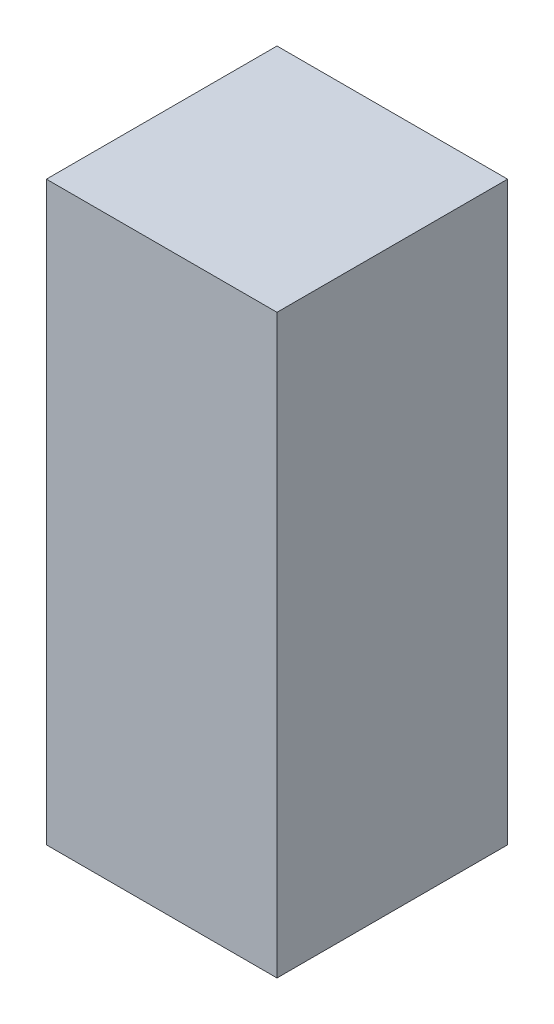
ISO-10303-21;
HEADER;
FILE_DESCRIPTION(('STEP AP214'),'2;1');
FILE_NAME('part.step','',(''),(''),'','','');
FILE_SCHEMA(('AUTOMOTIVE_DESIGN { 1 0 10303 214 1 1 1 1 }'));
ENDSEC;
DATA;
#1=APPLICATION_CONTEXT('core data for automotive mechanical design processes');
#2=APPLICATION_PROTOCOL_DEFINITION('international standard','automotive_design',2000,#1);
#3=PRODUCT_CONTEXT('',#1,'mechanical');
#4=PRODUCT('Part','Part','',(#3));
#5=PRODUCT_RELATED_PRODUCT_CATEGORY('part','',(#4));
#6=PRODUCT_DEFINITION_FORMATION('','',#4);
#7=PRODUCT_DEFINITION_CONTEXT('part definition',#1,'design');
#8=PRODUCT_DEFINITION('design','',#6,#7);
#9=PRODUCT_DEFINITION_SHAPE('','',#8);
#10=(LENGTH_UNIT() NAMED_UNIT(*) SI_UNIT(.MILLI.,.METRE.));
#11=(NAMED_UNIT(*) PLANE_ANGLE_UNIT() SI_UNIT($,.RADIAN.));
#12=(NAMED_UNIT(*) SI_UNIT($,.STERADIAN.) SOLID_ANGLE_UNIT());
#13=UNCERTAINTY_MEASURE_WITH_UNIT(LENGTH_MEASURE(1.E-05),#10,'distance_accuracy_value','');
#14=(GEOMETRIC_REPRESENTATION_CONTEXT(3) GLOBAL_UNCERTAINTY_ASSIGNED_CONTEXT((#13)) GLOBAL_UNIT_ASSIGNED_CONTEXT((#10,
#11,#12)) REPRESENTATION_CONTEXT('',''));
#15=CARTESIAN_POINT('',(0.,0.,0.));
#16=DIRECTION('',(0.,0.,1.));
#17=DIRECTION('',(1.,0.,0.));
#18=AXIS2_PLACEMENT_3D('',#15,#16,#17);
#19=CARTESIAN_POINT('',(-487.247374962251,100.,647.030369645084));
#20=DIRECTION('',(1.,0.,0.));
#21=DIRECTION('',(0.,0.,-1.));
#22=AXIS2_PLACEMENT_3D('',#19,#20,#21);
#23=PLANE('',#22);
#24=DIRECTION('',(0.,0.,1.));
#25=VECTOR('',#24,1.);
#26=CARTESIAN_POINT('',(-487.247374962251,0.,647.030369645084));
#27=LINE('',#26,#25);
#28=CARTESIAN_POINT('',(-487.247374962251,0.,647.030369645084));
#29=VERTEX_POINT('',#28);
#30=CARTESIAN_POINT('',(-487.247374962251,0.,687.030369645084));
#31=VERTEX_POINT('',#30);
#32=EDGE_CURVE('E98',#29,#31,#27,.T.);
#33=ORIENTED_EDGE('',*,*,#32,.T.);
#34=DIRECTION('',(0.,-1.,0.));
#35=VECTOR('',#34,1.);
#36=CARTESIAN_POINT('',(-487.247374962251,100.,687.030369645084));
#37=LINE('',#36,#35);
#38=CARTESIAN_POINT('',(-487.247374962251,100.,687.030369645084));
#39=VERTEX_POINT('',#38);
#40=EDGE_CURVE('E11',#39,#31,#37,.T.);
#41=ORIENTED_EDGE('',*,*,#40,.F.);
#42=DIRECTION('',(0.,0.,1.));
#43=VECTOR('',#42,1.);
#44=CARTESIAN_POINT('',(-487.247374962251,100.,647.030369645084));
#45=LINE('',#44,#43);
#46=CARTESIAN_POINT('',(-487.247374962251,100.,647.030369645084));
#47=VERTEX_POINT('',#46);
#48=EDGE_CURVE('E86',#47,#39,#45,.T.);
#49=ORIENTED_EDGE('',*,*,#48,.F.);
#50=DIRECTION('',(0.,-1.,0.));
#51=VECTOR('',#50,1.);
#52=CARTESIAN_POINT('',(-487.247374962251,100.,647.030369645084));
#53=LINE('',#52,#51);
#54=EDGE_CURVE('E94',#47,#29,#53,.T.);
#55=ORIENTED_EDGE('',*,*,#54,.T.);
#56=EDGE_LOOP('',(#33,#41,#49,#55));
#57=FACE_BOUND('',#56,.T.);
#58=ADVANCED_FACE('F35',(#57),#23,.F.);
#59=CARTESIAN_POINT('',(-487.247374962251,100.,687.030369645084));
#60=DIRECTION('',(0.,0.,-1.));
#61=DIRECTION('',(-1.,0.,0.));
#62=AXIS2_PLACEMENT_3D('',#59,#60,#61);
#63=PLANE('',#62);
#64=DIRECTION('',(1.,0.,0.));
#65=VECTOR('',#64,1.);
#66=CARTESIAN_POINT('',(-487.247374962251,0.,687.030369645084));
#67=LINE('',#66,#65);
#68=CARTESIAN_POINT('',(-447.247374962251,0.,687.030369645084));
#69=VERTEX_POINT('',#68);
#70=EDGE_CURVE('E90',#31,#69,#67,.T.);
#71=ORIENTED_EDGE('',*,*,#70,.T.);
#72=DIRECTION('',(0.,-1.,0.));
#73=VECTOR('',#72,1.);
#74=CARTESIAN_POINT('',(-447.247374962251,100.,687.030369645084));
#75=LINE('',#74,#73);
#76=CARTESIAN_POINT('',(-447.247374962251,100.,687.030369645084));
#77=VERTEX_POINT('',#76);
#78=EDGE_CURVE('E43',#77,#69,#75,.T.);
#79=ORIENTED_EDGE('',*,*,#78,.F.);
#80=DIRECTION('',(1.,0.,0.));
#81=VECTOR('',#80,1.);
#82=CARTESIAN_POINT('',(-487.247374962251,100.,687.030369645084));
#83=LINE('',#82,#81);
#84=EDGE_CURVE('E81',#39,#77,#83,.T.);
#85=ORIENTED_EDGE('',*,*,#84,.F.);
#86=ORIENTED_EDGE('',*,*,#40,.T.);
#87=EDGE_LOOP('',(#71,#79,#85,#86));
#88=FACE_BOUND('',#87,.T.);
#89=ADVANCED_FACE('F89',(#88),#63,.F.);
#90=CARTESIAN_POINT('',(-447.247374962251,100.,647.030369645084));
#91=DIRECTION('',(-1.,0.,0.));
#92=DIRECTION('',(0.,0.,1.));
#93=AXIS2_PLACEMENT_3D('',#90,#91,#92);
#94=PLANE('',#93);
#95=DIRECTION('',(0.,0.,-1.));
#96=VECTOR('',#95,1.);
#97=CARTESIAN_POINT('',(-447.247374962251,0.,647.030369645084));
#98=LINE('',#97,#96);
#99=CARTESIAN_POINT('',(-447.247374962251,0.,647.030369645084));
#100=VERTEX_POINT('',#99);
#101=EDGE_CURVE('E68',#69,#100,#98,.T.);
#102=ORIENTED_EDGE('',*,*,#101,.T.);
#103=DIRECTION('',(0.,-1.,0.));
#104=VECTOR('',#103,1.);
#105=CARTESIAN_POINT('',(-447.247374962251,100.,647.030369645084));
#106=LINE('',#105,#104);
#107=CARTESIAN_POINT('',(-447.247374962251,100.,647.030369645084));
#108=VERTEX_POINT('',#107);
#109=EDGE_CURVE('E91',#108,#100,#106,.T.);
#110=ORIENTED_EDGE('',*,*,#109,.F.);
#111=DIRECTION('',(0.,0.,-1.));
#112=VECTOR('',#111,1.);
#113=CARTESIAN_POINT('',(-447.247374962251,100.,647.030369645084));
#114=LINE('',#113,#112);
#115=EDGE_CURVE('E84',#77,#108,#114,.T.);
#116=ORIENTED_EDGE('',*,*,#115,.F.);
#117=ORIENTED_EDGE('',*,*,#78,.T.);
#118=EDGE_LOOP('',(#102,#110,#116,#117));
#119=FACE_BOUND('',#118,.T.);
#120=ADVANCED_FACE('F92',(#119),#94,.F.);
#121=CARTESIAN_POINT('',(-487.247374962251,100.,647.030369645084));
#122=DIRECTION('',(0.,0.,1.));
#123=DIRECTION('',(1.,0.,0.));
#124=AXIS2_PLACEMENT_3D('',#121,#122,#123);
#125=PLANE('',#124);
#126=DIRECTION('',(-1.,0.,0.));
#127=VECTOR('',#126,1.);
#128=CARTESIAN_POINT('',(-487.247374962251,0.,647.030369645084));
#129=LINE('',#128,#127);
#130=EDGE_CURVE('E74',#100,#29,#129,.T.);
#131=ORIENTED_EDGE('',*,*,#130,.T.);
#132=ORIENTED_EDGE('',*,*,#54,.F.);
#133=DIRECTION('',(-1.,0.,0.));
#134=VECTOR('',#133,1.);
#135=CARTESIAN_POINT('',(-487.247374962251,100.,647.030369645084));
#136=LINE('',#135,#134);
#137=EDGE_CURVE('E51',#108,#47,#136,.T.);
#138=ORIENTED_EDGE('',*,*,#137,.F.);
#139=ORIENTED_EDGE('',*,*,#109,.T.);
#140=EDGE_LOOP('',(#131,#132,#138,#139));
#141=FACE_BOUND('',#140,.T.);
#142=ADVANCED_FACE('F105',(#141),#125,.F.);
#143=CARTESIAN_POINT('',(0.,100.,0.));
#144=DIRECTION('',(0.,1.,0.));
#145=DIRECTION('',(0.,0.,1.));
#146=AXIS2_PLACEMENT_3D('',#143,#144,#145);
#147=PLANE('',#146);
#148=ORIENTED_EDGE('',*,*,#48,.T.);
#149=ORIENTED_EDGE('',*,*,#84,.T.);
#150=ORIENTED_EDGE('',*,*,#115,.T.);
#151=ORIENTED_EDGE('',*,*,#137,.T.);
#152=EDGE_LOOP('',(#148,#149,#150,#151));
#153=FACE_BOUND('',#152,.T.);
#154=ADVANCED_FACE('F82',(#153),#147,.T.);
#155=CARTESIAN_POINT('',(0.,0.,0.));
#156=DIRECTION('',(0.,1.,0.));
#157=DIRECTION('',(0.,0.,1.));
#158=AXIS2_PLACEMENT_3D('',#155,#156,#157);
#159=PLANE('',#158);
#160=ORIENTED_EDGE('',*,*,#32,.F.);
#161=ORIENTED_EDGE('',*,*,#130,.F.);
#162=ORIENTED_EDGE('',*,*,#101,.F.);
#163=ORIENTED_EDGE('',*,*,#70,.F.);
#164=EDGE_LOOP('',(#160,#161,#162,#163));
#165=FACE_BOUND('',#164,.T.);
#166=ADVANCED_FACE('F108',(#165),#159,.F.);
#167=CLOSED_SHELL('',(#58,#89,#120,#142,#154,#166));
#168=MANIFOLD_SOLID_BREP('B2',#167);
#169=ADVANCED_BREP_SHAPE_REPRESENTATION('',(#18,#168),#14);
#170=SHAPE_DEFINITION_REPRESENTATION(#9,#169);
ENDSEC;
END-ISO-10303-21;
